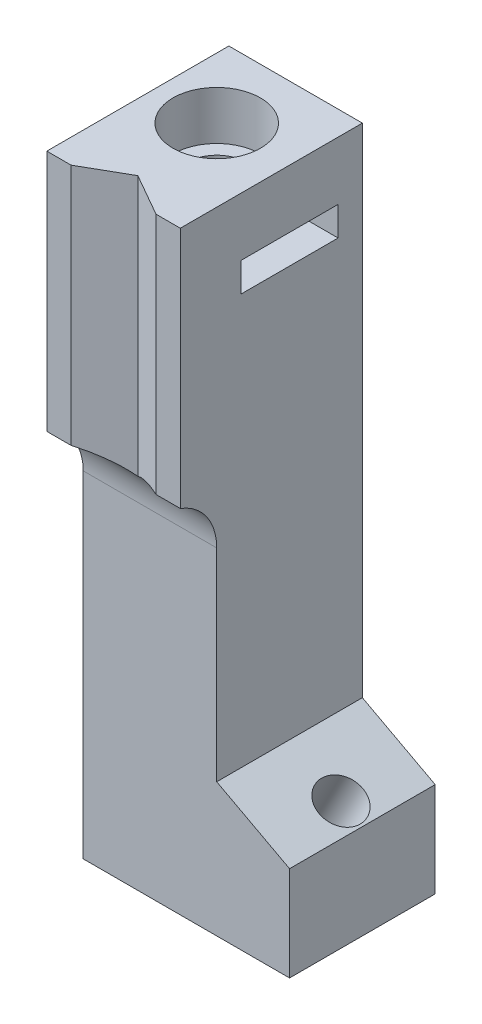
ISO-10303-21;
HEADER;
FILE_DESCRIPTION(('STEP AP214'),'2;1');
FILE_NAME('part.step','',(''),(''),'','','');
FILE_SCHEMA(('AUTOMOTIVE_DESIGN { 1 0 10303 214 1 1 1 1 }'));
ENDSEC;
DATA;
#1=APPLICATION_CONTEXT('core data for automotive mechanical design processes');
#2=APPLICATION_PROTOCOL_DEFINITION('international standard','automotive_design',2000,#1);
#3=PRODUCT_CONTEXT('',#1,'mechanical');
#4=PRODUCT('Part','Part','',(#3));
#5=PRODUCT_RELATED_PRODUCT_CATEGORY('part','',(#4));
#6=PRODUCT_DEFINITION_FORMATION('','',#4);
#7=PRODUCT_DEFINITION_CONTEXT('part definition',#1,'design');
#8=PRODUCT_DEFINITION('design','',#6,#7);
#9=PRODUCT_DEFINITION_SHAPE('','',#8);
#10=(LENGTH_UNIT() NAMED_UNIT(*) SI_UNIT(.MILLI.,.METRE.));
#11=(NAMED_UNIT(*) PLANE_ANGLE_UNIT() SI_UNIT($,.RADIAN.));
#12=(NAMED_UNIT(*) SI_UNIT($,.STERADIAN.) SOLID_ANGLE_UNIT());
#13=UNCERTAINTY_MEASURE_WITH_UNIT(LENGTH_MEASURE(1.E-05),#10,'distance_accuracy_value','');
#14=(GEOMETRIC_REPRESENTATION_CONTEXT(3) GLOBAL_UNCERTAINTY_ASSIGNED_CONTEXT((#13)) GLOBAL_UNIT_ASSIGNED_CONTEXT((#10,
#11,#12)) REPRESENTATION_CONTEXT('',''));
#15=CARTESIAN_POINT('',(0.,0.,0.));
#16=DIRECTION('',(0.,0.,1.));
#17=DIRECTION('',(1.,0.,0.));
#18=AXIS2_PLACEMENT_3D('',#15,#16,#17);
#19=CARTESIAN_POINT('',(2.50000000000003,19.75,0.));
#20=DIRECTION('',(0.,-1.,0.));
#21=DIRECTION('',(1.,0.,0.));
#22=AXIS2_PLACEMENT_3D('',#19,#20,#21);
#23=CYLINDRICAL_SURFACE('',#22,0.605);
#24=CARTESIAN_POINT('',(2.50000000000003,19.55,0.));
#25=DIRECTION('',(0.,1.,0.));
#26=DIRECTION('',(0.,0.,1.));
#27=AXIS2_PLACEMENT_3D('',#24,#25,#26);
#28=CIRCLE('',#27,0.605);
#29=CARTESIAN_POINT('',(2.50000000000003,19.55,0.605000000000023));
#30=VERTEX_POINT('',#29);
#31=EDGE_CURVE('E200',#30,#30,#28,.T.);
#32=ORIENTED_EDGE('',*,*,#31,.F.);
#33=EDGE_LOOP('',(#32));
#34=FACE_BOUND('',#33,.T.);
#35=CARTESIAN_POINT('',(2.50000000000003,19.75,0.));
#36=DIRECTION('',(0.,1.,0.));
#37=DIRECTION('',(-1.,0.,0.));
#38=AXIS2_PLACEMENT_3D('',#35,#36,#37);
#39=CIRCLE('',#38,0.605);
#40=CARTESIAN_POINT('',(1.89500000000003,19.75,0.));
#41=VERTEX_POINT('',#40);
#42=EDGE_CURVE('E240',#41,#41,#39,.T.);
#43=ORIENTED_EDGE('',*,*,#42,.T.);
#44=EDGE_LOOP('',(#43));
#45=FACE_BOUND('',#44,.T.);
#46=ADVANCED_FACE('F39',(#34,#45),#23,.F.);
#47=CARTESIAN_POINT('',(0.,0.,2.24999999996326));
#48=DIRECTION('',(0.,0.,-1.));
#49=DIRECTION('',(-1.,0.,0.));
#50=AXIS2_PLACEMENT_3D('',#47,#48,#49);
#51=PLANE('',#50);
#52=DIRECTION('',(1.,0.,0.));
#53=VECTOR('',#52,1.);
#54=CARTESIAN_POINT('',(4.00000000001019,15.75,2.24999999996326));
#55=LINE('',#54,#53);
#56=CARTESIAN_POINT('',(1.25000000001018,15.75,2.24999999996326));
#57=VERTEX_POINT('',#56);
#58=CARTESIAN_POINT('',(1.75000000001019,15.75,2.24999999996326));
#59=VERTEX_POINT('',#58);
#60=EDGE_CURVE('E221',#57,#59,#55,.T.);
#61=ORIENTED_EDGE('',*,*,#60,.T.);
#62=DIRECTION('',(0.,1.,0.));
#63=VECTOR('',#62,1.);
#64=CARTESIAN_POINT('',(1.75000000001014,0.,2.24999999996326));
#65=LINE('',#64,#63);
#66=CARTESIAN_POINT('',(1.7500000000102,20.75,2.24999999996327));
#67=VERTEX_POINT('',#66);
#68=EDGE_CURVE('E324',#59,#67,#65,.T.);
#69=ORIENTED_EDGE('',*,*,#68,.T.);
#70=DIRECTION('',(-1.,0.,0.));
#71=VECTOR('',#70,1.);
#72=CARTESIAN_POINT('',(4.00000000001018,20.75,2.24999999996326));
#73=LINE('',#72,#71);
#74=CARTESIAN_POINT('',(1.25000000001019,20.75,2.24999999996326));
#75=VERTEX_POINT('',#74);
#76=EDGE_CURVE('E213',#67,#75,#73,.T.);
#77=ORIENTED_EDGE('',*,*,#76,.T.);
#78=DIRECTION('',(0.,-1.,0.));
#79=VECTOR('',#78,1.);
#80=CARTESIAN_POINT('',(1.25000000001019,20.75,2.24999999996326));
#81=LINE('',#80,#79);
#82=EDGE_CURVE('E217',#75,#57,#81,.T.);
#83=ORIENTED_EDGE('',*,*,#82,.T.);
#84=EDGE_LOOP('',(#61,#69,#77,#83));
#85=FACE_BOUND('',#84,.T.);
#86=ADVANCED_FACE('F347',(#85),#51,.F.);
#87=CARTESIAN_POINT('',(0.,19.75,0.));
#88=DIRECTION('',(0.,1.,0.));
#89=DIRECTION('',(-1.,0.,0.));
#90=AXIS2_PLACEMENT_3D('',#87,#88,#89);
#91=PLANE('',#90);
#92=ORIENTED_EDGE('',*,*,#42,.F.);
#93=EDGE_LOOP('',(#92));
#94=FACE_BOUND('',#93,.T.);
#95=CARTESIAN_POINT('',(2.50000000000002,19.75,0.));
#96=DIRECTION('',(0.,1.,0.));
#97=DIRECTION('',(-1.,0.,0.));
#98=AXIS2_PLACEMENT_3D('',#95,#96,#97);
#99=CIRCLE('',#98,0.9);
#100=CARTESIAN_POINT('',(1.60000000000002,19.75,0.));
#101=VERTEX_POINT('',#100);
#102=EDGE_CURVE('E224',#101,#101,#99,.T.);
#103=ORIENTED_EDGE('',*,*,#102,.T.);
#104=EDGE_LOOP('',(#103));
#105=FACE_BOUND('',#104,.T.);
#106=ADVANCED_FACE('F352',(#94,#105),#91,.T.);
#107=CARTESIAN_POINT('',(0.,18.75,0.));
#108=DIRECTION('',(0.,1.,0.));
#109=DIRECTION('',(-1.,0.,0.));
#110=AXIS2_PLACEMENT_3D('',#107,#108,#109);
#111=PLANE('',#110);
#112=CARTESIAN_POINT('',(2.50000000000001,18.75,0.));
#113=DIRECTION('',(0.,1.,0.));
#114=DIRECTION('',(-1.,0.,0.));
#115=AXIS2_PLACEMENT_3D('',#112,#113,#114);
#116=CIRCLE('',#115,0.425);
#117=CARTESIAN_POINT('',(2.07500000000001,18.75,0.));
#118=VERTEX_POINT('',#117);
#119=EDGE_CURVE('E292',#118,#118,#116,.T.);
#120=ORIENTED_EDGE('',*,*,#119,.F.);
#121=EDGE_LOOP('',(#120));
#122=FACE_BOUND('',#121,.T.);
#123=CARTESIAN_POINT('',(2.50000000000003,18.75,0.));
#124=DIRECTION('',(0.,1.,0.));
#125=DIRECTION('',(-1.,0.,0.));
#126=AXIS2_PLACEMENT_3D('',#123,#124,#125);
#127=CIRCLE('',#126,0.605);
#128=CARTESIAN_POINT('',(1.89500000000003,18.75,0.));
#129=VERTEX_POINT('',#128);
#130=EDGE_CURVE('E239',#129,#129,#127,.T.);
#131=ORIENTED_EDGE('',*,*,#130,.T.);
#132=EDGE_LOOP('',(#131));
#133=FACE_BOUND('',#132,.T.);
#134=ADVANCED_FACE('F355',(#122,#133),#111,.T.);
#135=CARTESIAN_POINT('',(1.25000000001017,17.75,1.49999999996326));
#136=DIRECTION('',(-1.,0.,0.));
#137=DIRECTION('',(0.,0.,1.));
#138=AXIS2_PLACEMENT_3D('',#135,#136,#137);
#139=PLANE('',#138);
#140=DIRECTION('',(0.,-1.,0.));
#141=VECTOR('',#140,1.);
#142=CARTESIAN_POINT('',(1.25000000001017,18.95,-0.999999999963246));
#143=LINE('',#142,#141);
#144=CARTESIAN_POINT('',(1.25000000001017,19.55,-0.999999999963246));
#145=VERTEX_POINT('',#144);
#146=CARTESIAN_POINT('',(1.25000000001017,18.95,-0.999999999963245));
#147=VERTEX_POINT('',#146);
#148=EDGE_CURVE('E54',#145,#147,#143,.T.);
#149=ORIENTED_EDGE('',*,*,#148,.F.);
#150=DIRECTION('',(0.,0.,-1.));
#151=VECTOR('',#150,1.);
#152=CARTESIAN_POINT('',(1.25000000001017,19.55,-0.999999999963246));
#153=LINE('',#152,#151);
#154=CARTESIAN_POINT('',(1.25000000001017,19.55,1.00000000003675));
#155=VERTEX_POINT('',#154);
#156=EDGE_CURVE('E188',#155,#145,#153,.T.);
#157=ORIENTED_EDGE('',*,*,#156,.F.);
#158=DIRECTION('',(0.,1.,0.));
#159=VECTOR('',#158,1.);
#160=CARTESIAN_POINT('',(1.25000000001017,18.95,1.00000000003675));
#161=LINE('',#160,#159);
#162=CARTESIAN_POINT('',(1.25000000001017,18.95,1.00000000003675));
#163=VERTEX_POINT('',#162);
#164=EDGE_CURVE('E172',#163,#155,#161,.T.);
#165=ORIENTED_EDGE('',*,*,#164,.F.);
#166=DIRECTION('',(0.,0.,1.));
#167=VECTOR('',#166,1.);
#168=CARTESIAN_POINT('',(1.25000000001017,18.95,-0.999999999963246));
#169=LINE('',#168,#167);
#170=EDGE_CURVE('E180',#147,#163,#169,.T.);
#171=ORIENTED_EDGE('',*,*,#170,.F.);
#172=EDGE_LOOP('',(#149,#157,#165,#171));
#173=FACE_BOUND('',#172,.T.);
#174=DIRECTION('',(0.,0.,-1.));
#175=VECTOR('',#174,1.);
#176=CARTESIAN_POINT('',(1.25000000001017,7.75,1.49999999996326));
#177=LINE('',#176,#175);
#178=CARTESIAN_POINT('',(1.25000000001017,7.75,-0.787687442733548));
#179=VERTEX_POINT('',#178);
#180=CARTESIAN_POINT('',(1.25000000001017,7.75,-1.50000000003674));
#181=VERTEX_POINT('',#180);
#182=EDGE_CURVE('E295',#179,#181,#177,.T.);
#183=ORIENTED_EDGE('',*,*,#182,.F.);
#184=DIRECTION('',(0.,1.,0.));
#185=VECTOR('',#184,1.);
#186=CARTESIAN_POINT('',(1.25000000001017,17.75,-0.787687442733547));
#187=LINE('',#186,#185);
#188=CARTESIAN_POINT('',(1.25000000001017,17.75,-0.787687442733547));
#189=VERTEX_POINT('',#188);
#190=EDGE_CURVE('E288',#179,#189,#187,.T.);
#191=ORIENTED_EDGE('',*,*,#190,.T.);
#192=DIRECTION('',(0.,0.,1.));
#193=VECTOR('',#192,1.);
#194=CARTESIAN_POINT('',(1.25000000001017,17.75,1.49999999996326));
#195=LINE('',#194,#193);
#196=CARTESIAN_POINT('',(1.25000000001017,17.75,0.787687442733547));
#197=VERTEX_POINT('',#196);
#198=EDGE_CURVE('E318',#189,#197,#195,.T.);
#199=ORIENTED_EDGE('',*,*,#198,.T.);
#200=DIRECTION('',(0.,-1.,0.));
#201=VECTOR('',#200,1.);
#202=CARTESIAN_POINT('',(1.25000000001017,17.75,0.787687442733547));
#203=LINE('',#202,#201);
#204=CARTESIAN_POINT('',(1.25000000001017,7.75,0.787687442733547));
#205=VERTEX_POINT('',#204);
#206=EDGE_CURVE('E285',#197,#205,#203,.T.);
#207=ORIENTED_EDGE('',*,*,#206,.T.);
#208=CARTESIAN_POINT('',(1.25000000001017,7.75,1.49999999996326));
#209=VERTEX_POINT('',#208);
#210=EDGE_CURVE('E296',#209,#205,#177,.T.);
#211=ORIENTED_EDGE('',*,*,#210,.F.);
#212=DIRECTION('',(0.,-1.,0.));
#213=VECTOR('',#212,1.);
#214=CARTESIAN_POINT('',(1.25000000001017,17.75,1.49999999996326));
#215=LINE('',#214,#213);
#216=CARTESIAN_POINT('',(1.25000000001017,14.6718070673576,1.49999999996326));
#217=VERTEX_POINT('',#216);
#218=EDGE_CURVE('E305',#217,#209,#215,.T.);
#219=ORIENTED_EDGE('',*,*,#218,.F.);
#220=CARTESIAN_POINT('',(1.25000000001017,14.6718070673576,2.64999999996326));
#221=DIRECTION('',(-1.,0.,0.));
#222=DIRECTION('',(0.,0.,1.));
#223=AXIS2_PLACEMENT_3D('',#220,#221,#222);
#224=CIRCLE('',#223,1.15);
#225=EDGE_CURVE('E336',#217,#57,#224,.F.);
#226=ORIENTED_EDGE('',*,*,#225,.T.);
#227=ORIENTED_EDGE('',*,*,#82,.F.);
#228=DIRECTION('',(0.,0.,1.));
#229=VECTOR('',#228,1.);
#230=CARTESIAN_POINT('',(1.25000000001019,20.75,-1.49999999996325));
#231=LINE('',#230,#229);
#232=CARTESIAN_POINT('',(1.25000000001019,20.75,-1.49999999996325));
#233=VERTEX_POINT('',#232);
#234=EDGE_CURVE('E236',#233,#75,#231,.T.);
#235=ORIENTED_EDGE('',*,*,#234,.F.);
#236=DIRECTION('',(0.,-1.,0.));
#237=VECTOR('',#236,1.);
#238=CARTESIAN_POINT('',(1.25000000001017,17.75,-1.50000000003674));
#239=LINE('',#238,#237);
#240=EDGE_CURVE('E304',#233,#181,#239,.T.);
#241=ORIENTED_EDGE('',*,*,#240,.T.);
#242=EDGE_LOOP('',(#183,#191,#199,#207,#211,#219,#226,#227,#235,#241));
#243=FACE_BOUND('',#242,.T.);
#244=ADVANCED_FACE('F185',(#173,#243),#139,.T.);
#245=CARTESIAN_POINT('',(0.,7.75,0.));
#246=DIRECTION('',(0.,1.,0.));
#247=DIRECTION('',(0.,0.,1.));
#248=AXIS2_PLACEMENT_3D('',#245,#246,#247);
#249=PLANE('',#248);
#250=CARTESIAN_POINT('',(3.8933333333435,7.75,0.));
#251=DIRECTION('',(0.,1.,0.));
#252=DIRECTION('',(1.,0.,0.));
#253=AXIS2_PLACEMENT_3D('',#250,#251,#252);
#254=ELLIPSE('',#253,0.50999999993427,0.449999999942003);
#255=CARTESIAN_POINT('',(4.40333333327777,7.75,0.));
#256=VERTEX_POINT('',#255);
#257=EDGE_CURVE('E708',#256,#256,#254,.T.);
#258=ORIENTED_EDGE('',*,*,#257,.T.);
#259=EDGE_LOOP('',(#258));
#260=FACE_BOUND('',#259,.T.);
#261=DIRECTION('',(-0.99954579976556,0.,0.0301362600703328));
#262=VECTOR('',#261,1.);
#263=CARTESIAN_POINT('',(0.,7.75,-0.75));
#264=LINE('',#263,#262);
#265=CARTESIAN_POINT('',(2.47513758544198,7.75,-0.824625284806589));
#266=VERTEX_POINT('',#265);
#267=EDGE_CURVE('E270',#266,#179,#264,.T.);
#268=ORIENTED_EDGE('',*,*,#267,.T.);
#269=ORIENTED_EDGE('',*,*,#182,.T.);
#270=DIRECTION('',(1.,0.,2.67195514451353E-11));
#271=VECTOR('',#270,1.);
#272=CARTESIAN_POINT('',(4.00000000001017,7.75,-1.49999999996326));
#273=LINE('',#272,#271);
#274=CARTESIAN_POINT('',(5.50000000001019,7.75,-1.49999999994322));
#275=VERTEX_POINT('',#274);
#276=EDGE_CURVE('E299',#181,#275,#273,.T.);
#277=ORIENTED_EDGE('',*,*,#276,.T.);
#278=DIRECTION('',(0.,0.,1.));
#279=VECTOR('',#278,1.);
#280=CARTESIAN_POINT('',(5.50000000001019,7.75,-4.63249102147864));
#281=LINE('',#280,#279);
#282=CARTESIAN_POINT('',(5.50000000001019,7.75,1.49999999996326));
#283=VERTEX_POINT('',#282);
#284=EDGE_CURVE('E249',#275,#283,#281,.T.);
#285=ORIENTED_EDGE('',*,*,#284,.T.);
#286=DIRECTION('',(-1.,0.,0.));
#287=VECTOR('',#286,1.);
#288=CARTESIAN_POINT('',(4.00000000001017,7.75,1.49999999996326));
#289=LINE('',#288,#287);
#290=EDGE_CURVE('E301',#283,#209,#289,.T.);
#291=ORIENTED_EDGE('',*,*,#290,.T.);
#292=ORIENTED_EDGE('',*,*,#210,.T.);
#293=DIRECTION('',(-0.99954579976556,0.,-0.0301362600703316));
#294=VECTOR('',#293,1.);
#295=CARTESIAN_POINT('',(-0.0225919291304569,7.75,0.749318854371731));
#296=LINE('',#295,#294);
#297=CARTESIAN_POINT('',(2.47513758544198,7.75,0.824625284806587));
#298=VERTEX_POINT('',#297);
#299=EDGE_CURVE('E307',#298,#205,#296,.T.);
#300=ORIENTED_EDGE('',*,*,#299,.F.);
#301=CARTESIAN_POINT('',(2.5,7.75,0.));
#302=DIRECTION('',(0.,1.,0.));
#303=DIRECTION('',(0.,0.,-1.));
#304=AXIS2_PLACEMENT_3D('',#301,#302,#303);
#305=CIRCLE('',#304,0.825000000000001);
#306=EDGE_CURVE('E262',#298,#266,#305,.T.);
#307=ORIENTED_EDGE('',*,*,#306,.T.);
#308=EDGE_LOOP('',(#268,#269,#277,#285,#291,#292,#300,#307));
#309=FACE_BOUND('',#308,.T.);
#310=ADVANCED_FACE('F411',(#260,#309),#249,.F.);
#311=CARTESIAN_POINT('',(4.00000000001017,17.75,1.49999999996326));
#312=DIRECTION('',(0.,0.,1.));
#313=DIRECTION('',(1.,0.,0.));
#314=AXIS2_PLACEMENT_3D('',#311,#312,#313);
#315=PLANE('',#314);
#316=DIRECTION('',(0.,-1.,0.));
#317=VECTOR('',#316,1.);
#318=CARTESIAN_POINT('',(4.00000000001017,17.75,1.49999999996326));
#319=LINE('',#318,#317);
#320=CARTESIAN_POINT('',(4.00000000001017,14.6718070673576,1.49999999996326));
#321=VERTEX_POINT('',#320);
#322=CARTESIAN_POINT('',(4.0000000000102,10.5,1.49999999996326));
#323=VERTEX_POINT('',#322);
#324=EDGE_CURVE('E308',#321,#323,#319,.T.);
#325=ORIENTED_EDGE('',*,*,#324,.F.);
#326=DIRECTION('',(1.,0.,0.));
#327=VECTOR('',#326,1.);
#328=CARTESIAN_POINT('',(1.25000000001017,14.6718070673576,1.49999999996326));
#329=LINE('',#328,#327);
#330=EDGE_CURVE('E327',#321,#217,#329,.F.);
#331=ORIENTED_EDGE('',*,*,#330,.T.);
#332=ORIENTED_EDGE('',*,*,#218,.T.);
#333=ORIENTED_EDGE('',*,*,#290,.F.);
#334=DIRECTION('',(0.,1.,0.));
#335=VECTOR('',#334,1.);
#336=CARTESIAN_POINT('',(5.50000000001019,7.75,1.49999999996326));
#337=LINE('',#336,#335);
#338=CARTESIAN_POINT('',(5.50000000001019,9.7,1.49999999996326));
#339=VERTEX_POINT('',#338);
#340=EDGE_CURVE('E246',#283,#339,#337,.T.);
#341=ORIENTED_EDGE('',*,*,#340,.T.);
#342=DIRECTION('',(-0.882352941176471,0.470588235294117,0.));
#343=VECTOR('',#342,1.);
#344=CARTESIAN_POINT('',(5.5000000000102,9.7,1.49999999996326));
#345=LINE('',#344,#343);
#346=EDGE_CURVE('E243',#339,#323,#345,.T.);
#347=ORIENTED_EDGE('',*,*,#346,.T.);
#348=EDGE_LOOP('',(#325,#331,#332,#333,#341,#347));
#349=FACE_BOUND('',#348,.T.);
#350=ADVANCED_FACE('F414',(#349),#315,.T.);
#351=CARTESIAN_POINT('',(4.00000000001017,17.75,1.49999999996326));
#352=DIRECTION('',(1.,0.,0.));
#353=DIRECTION('',(0.,0.,-1.));
#354=AXIS2_PLACEMENT_3D('',#351,#352,#353);
#355=PLANE('',#354);
#356=DIRECTION('',(0.,1.,0.));
#357=VECTOR('',#356,1.);
#358=CARTESIAN_POINT('',(4.00000000001017,17.75,-0.999999999963246));
#359=LINE('',#358,#357);
#360=CARTESIAN_POINT('',(4.00000000001017,18.95,-0.999999999963246));
#361=VERTEX_POINT('',#360);
#362=CARTESIAN_POINT('',(4.00000000001017,19.55,-0.999999999963246));
#363=VERTEX_POINT('',#362);
#364=EDGE_CURVE('E11',#361,#363,#359,.T.);
#365=ORIENTED_EDGE('',*,*,#364,.F.);
#366=DIRECTION('',(0.,0.,-1.));
#367=VECTOR('',#366,1.);
#368=CARTESIAN_POINT('',(4.00000000001017,18.95,1.49999999996326));
#369=LINE('',#368,#367);
#370=CARTESIAN_POINT('',(4.00000000001017,18.95,1.00000000003675));
#371=VERTEX_POINT('',#370);
#372=EDGE_CURVE('E198',#371,#361,#369,.T.);
#373=ORIENTED_EDGE('',*,*,#372,.F.);
#374=DIRECTION('',(0.,-1.,0.));
#375=VECTOR('',#374,1.);
#376=CARTESIAN_POINT('',(4.00000000001017,17.75,1.00000000003675));
#377=LINE('',#376,#375);
#378=CARTESIAN_POINT('',(4.00000000001017,19.55,1.00000000003675));
#379=VERTEX_POINT('',#378);
#380=EDGE_CURVE('E47',#379,#371,#377,.T.);
#381=ORIENTED_EDGE('',*,*,#380,.F.);
#382=DIRECTION('',(0.,0.,1.));
#383=VECTOR('',#382,1.);
#384=CARTESIAN_POINT('',(4.00000000001017,19.55,1.49999999996326));
#385=LINE('',#384,#383);
#386=EDGE_CURVE('E201',#363,#379,#385,.T.);
#387=ORIENTED_EDGE('',*,*,#386,.F.);
#388=EDGE_LOOP('',(#365,#373,#381,#387));
#389=FACE_BOUND('',#388,.T.);
#390=DIRECTION('',(0.,0.,1.));
#391=VECTOR('',#390,1.);
#392=CARTESIAN_POINT('',(4.0000000000102,10.5,-4.63249102147864));
#393=LINE('',#392,#391);
#394=CARTESIAN_POINT('',(4.00000000001017,10.5,-1.49999999996326));
#395=VERTEX_POINT('',#394);
#396=EDGE_CURVE('E255',#395,#323,#393,.T.);
#397=ORIENTED_EDGE('',*,*,#396,.F.);
#398=DIRECTION('',(0.,-1.,0.));
#399=VECTOR('',#398,1.);
#400=CARTESIAN_POINT('',(4.00000000001017,17.75,-1.49999999996326));
#401=LINE('',#400,#399);
#402=CARTESIAN_POINT('',(4.00000000001019,20.75,-1.49999999996325));
#403=VERTEX_POINT('',#402);
#404=EDGE_CURVE('E310',#403,#395,#401,.T.);
#405=ORIENTED_EDGE('',*,*,#404,.F.);
#406=DIRECTION('',(0.,0.,-1.));
#407=VECTOR('',#406,1.);
#408=CARTESIAN_POINT('',(4.00000000001019,20.75,-1.49999999996325));
#409=LINE('',#408,#407);
#410=CARTESIAN_POINT('',(4.00000000001018,20.75,2.24999999996326));
#411=VERTEX_POINT('',#410);
#412=EDGE_CURVE('E228',#411,#403,#409,.T.);
#413=ORIENTED_EDGE('',*,*,#412,.F.);
#414=DIRECTION('',(0.,1.,0.));
#415=VECTOR('',#414,1.);
#416=CARTESIAN_POINT('',(4.00000000001018,20.75,2.24999999996326));
#417=LINE('',#416,#415);
#418=CARTESIAN_POINT('',(4.00000000001019,15.75,2.24999999996326));
#419=VERTEX_POINT('',#418);
#420=EDGE_CURVE('E210',#419,#411,#417,.T.);
#421=ORIENTED_EDGE('',*,*,#420,.F.);
#422=CARTESIAN_POINT('',(4.00000000001017,14.6718070673576,2.64999999996326));
#423=DIRECTION('',(1.,0.,0.));
#424=DIRECTION('',(0.,0.,-1.));
#425=AXIS2_PLACEMENT_3D('',#422,#423,#424);
#426=CIRCLE('',#425,1.15);
#427=EDGE_CURVE('E334',#419,#321,#426,.F.);
#428=ORIENTED_EDGE('',*,*,#427,.T.);
#429=ORIENTED_EDGE('',*,*,#324,.T.);
#430=EDGE_LOOP('',(#397,#405,#413,#421,#428,#429));
#431=FACE_BOUND('',#430,.T.);
#432=ADVANCED_FACE('F418',(#389,#431),#355,.T.);
#433=CARTESIAN_POINT('',(4.00000000001017,17.75,-1.49999999996326));
#434=DIRECTION('',(2.67195514451353E-11,0.,-1.));
#435=DIRECTION('',(-1.,0.,-2.67195514451353E-11));
#436=AXIS2_PLACEMENT_3D('',#433,#434,#435);
#437=PLANE('',#436);
#438=ORIENTED_EDGE('',*,*,#276,.F.);
#439=ORIENTED_EDGE('',*,*,#240,.F.);
#440=DIRECTION('',(-1.,0.,0.));
#441=VECTOR('',#440,1.);
#442=CARTESIAN_POINT('',(4.00000000001019,20.75,-1.49999999996325));
#443=LINE('',#442,#441);
#444=EDGE_CURVE('E233',#403,#233,#443,.T.);
#445=ORIENTED_EDGE('',*,*,#444,.F.);
#446=ORIENTED_EDGE('',*,*,#404,.T.);
#447=DIRECTION('',(-0.882352941176471,0.470588235294117,-2.35760748045312E-11));
#448=VECTOR('',#447,1.);
#449=CARTESIAN_POINT('',(5.49999999994503,9.70000000003475,-1.49999999992318));
#450=LINE('',#449,#448);
#451=CARTESIAN_POINT('',(5.50000000001019,9.7,-1.49999999992318));
#452=VERTEX_POINT('',#451);
#453=EDGE_CURVE('E252',#452,#395,#450,.T.);
#454=ORIENTED_EDGE('',*,*,#453,.F.);
#455=DIRECTION('',(0.,1.,0.));
#456=VECTOR('',#455,1.);
#457=CARTESIAN_POINT('',(5.50000000001019,7.75,-1.49999999992318));
#458=LINE('',#457,#456);
#459=EDGE_CURVE('E257',#275,#452,#458,.T.);
#460=ORIENTED_EDGE('',*,*,#459,.F.);
#461=EDGE_LOOP('',(#438,#439,#445,#446,#454,#460));
#462=FACE_BOUND('',#461,.T.);
#463=ADVANCED_FACE('F406',(#462),#437,.T.);
#464=CARTESIAN_POINT('',(2.50000000000001,18.75,0.));
#465=DIRECTION('',(0.,-1.,0.));
#466=DIRECTION('',(1.,0.,0.));
#467=AXIS2_PLACEMENT_3D('',#464,#465,#466);
#468=CYLINDRICAL_SURFACE('',#467,0.425);
#469=ORIENTED_EDGE('',*,*,#119,.T.);
#470=EDGE_LOOP('',(#469));
#471=FACE_BOUND('',#470,.T.);
#472=CARTESIAN_POINT('',(2.50000000000001,17.75,0.));
#473=DIRECTION('',(0.,1.,0.));
#474=DIRECTION('',(0.,0.,1.));
#475=AXIS2_PLACEMENT_3D('',#472,#473,#474);
#476=CIRCLE('',#475,0.425);
#477=CARTESIAN_POINT('',(2.50000000000001,17.75,0.425000000000002));
#478=VERTEX_POINT('',#477);
#479=EDGE_CURVE('E291',#478,#478,#476,.F.);
#480=ORIENTED_EDGE('',*,*,#479,.T.);
#481=EDGE_LOOP('',(#480));
#482=FACE_BOUND('',#481,.T.);
#483=ADVANCED_FACE('F402',(#471,#482),#468,.F.);
#484=CARTESIAN_POINT('',(2.5,17.75,0.));
#485=DIRECTION('',(0.,-1.,0.));
#486=DIRECTION('',(0.,0.,-1.));
#487=AXIS2_PLACEMENT_3D('',#484,#485,#486);
#488=CYLINDRICAL_SURFACE('',#487,0.825000000000001);
#489=ORIENTED_EDGE('',*,*,#306,.F.);
#490=DIRECTION('',(0.,-1.,0.));
#491=VECTOR('',#490,1.);
#492=CARTESIAN_POINT('',(2.47513758544198,17.75,0.824625284806587));
#493=LINE('',#492,#491);
#494=CARTESIAN_POINT('',(2.47513758544198,17.75,0.824625284806587));
#495=VERTEX_POINT('',#494);
#496=EDGE_CURVE('E275',#495,#298,#493,.T.);
#497=ORIENTED_EDGE('',*,*,#496,.F.);
#498=CARTESIAN_POINT('',(2.5,17.75,0.));
#499=DIRECTION('',(0.,1.,0.));
#500=DIRECTION('',(0.,0.,-1.));
#501=AXIS2_PLACEMENT_3D('',#498,#499,#500);
#502=CIRCLE('',#501,0.825000000000001);
#503=CARTESIAN_POINT('',(2.47513758544198,17.75,-0.824625284806589));
#504=VERTEX_POINT('',#503);
#505=EDGE_CURVE('E266',#495,#504,#502,.T.);
#506=ORIENTED_EDGE('',*,*,#505,.T.);
#507=DIRECTION('',(0.,-1.,0.));
#508=VECTOR('',#507,1.);
#509=CARTESIAN_POINT('',(2.47513758544198,17.75,-0.824625284806589));
#510=LINE('',#509,#508);
#511=EDGE_CURVE('E282',#504,#266,#510,.T.);
#512=ORIENTED_EDGE('',*,*,#511,.T.);
#513=EDGE_LOOP('',(#489,#497,#506,#512));
#514=FACE_BOUND('',#513,.T.);
#515=ADVANCED_FACE('F398',(#514),#488,.F.);
#516=CARTESIAN_POINT('',(0.,17.75,-0.75));
#517=DIRECTION('',(0.0301362600703328,0.,0.99954579976556));
#518=DIRECTION('',(0.99954579976556,0.,-0.0301362600703328));
#519=AXIS2_PLACEMENT_3D('',#516,#517,#518);
#520=PLANE('',#519);
#521=ORIENTED_EDGE('',*,*,#267,.F.);
#522=ORIENTED_EDGE('',*,*,#511,.F.);
#523=DIRECTION('',(-0.99954579976556,0.,0.0301362600703328));
#524=VECTOR('',#523,1.);
#525=CARTESIAN_POINT('',(0.,17.75,-0.75));
#526=LINE('',#525,#524);
#527=EDGE_CURVE('E269',#504,#189,#526,.T.);
#528=ORIENTED_EDGE('',*,*,#527,.T.);
#529=ORIENTED_EDGE('',*,*,#190,.F.);
#530=EDGE_LOOP('',(#521,#522,#528,#529));
#531=FACE_BOUND('',#530,.T.);
#532=ADVANCED_FACE('F394',(#531),#520,.T.);
#533=CARTESIAN_POINT('',(0.,17.75,0.750000000000001));
#534=DIRECTION('',(0.0301362600703316,0.,-0.99954579976556));
#535=DIRECTION('',(-0.99954579976556,0.,-0.0301362600703316));
#536=AXIS2_PLACEMENT_3D('',#533,#534,#535);
#537=PLANE('',#536);
#538=DIRECTION('',(0.99954579976556,0.,0.0301362600703316));
#539=VECTOR('',#538,1.);
#540=CARTESIAN_POINT('',(0.,17.75,0.750000000000001));
#541=LINE('',#540,#539);
#542=EDGE_CURVE('E273',#197,#495,#541,.T.);
#543=ORIENTED_EDGE('',*,*,#542,.T.);
#544=ORIENTED_EDGE('',*,*,#496,.T.);
#545=ORIENTED_EDGE('',*,*,#299,.T.);
#546=ORIENTED_EDGE('',*,*,#206,.F.);
#547=EDGE_LOOP('',(#543,#544,#545,#546));
#548=FACE_BOUND('',#547,.T.);
#549=ADVANCED_FACE('F390',(#548),#537,.T.);
#550=CARTESIAN_POINT('',(2.5,17.75,0.));
#551=DIRECTION('',(0.,-1.,0.));
#552=DIRECTION('',(0.,0.,-1.));
#553=AXIS2_PLACEMENT_3D('',#550,#551,#552);
#554=PLANE('',#553);
#555=ORIENTED_EDGE('',*,*,#479,.F.);
#556=EDGE_LOOP('',(#555));
#557=FACE_BOUND('',#556,.T.);
#558=ORIENTED_EDGE('',*,*,#527,.F.);
#559=ORIENTED_EDGE('',*,*,#505,.F.);
#560=ORIENTED_EDGE('',*,*,#542,.F.);
#561=ORIENTED_EDGE('',*,*,#198,.F.);
#562=EDGE_LOOP('',(#558,#559,#560,#561));
#563=FACE_BOUND('',#562,.T.);
#564=ADVANCED_FACE('F386',(#557,#563),#554,.T.);
#565=CARTESIAN_POINT('',(5.50000000001019,7.75,-4.63249102147864));
#566=DIRECTION('',(1.,0.,0.));
#567=DIRECTION('',(0.,0.,-1.));
#568=AXIS2_PLACEMENT_3D('',#565,#566,#567);
#569=PLANE('',#568);
#570=ORIENTED_EDGE('',*,*,#284,.F.);
#571=ORIENTED_EDGE('',*,*,#459,.T.);
#572=DIRECTION('',(0.,0.,1.));
#573=VECTOR('',#572,1.);
#574=CARTESIAN_POINT('',(5.50000000001019,9.7,-4.63249102147864));
#575=LINE('',#574,#573);
#576=EDGE_CURVE('E256',#452,#339,#575,.T.);
#577=ORIENTED_EDGE('',*,*,#576,.T.);
#578=ORIENTED_EDGE('',*,*,#340,.F.);
#579=EDGE_LOOP('',(#570,#571,#577,#578));
#580=FACE_BOUND('',#579,.T.);
#581=ADVANCED_FACE('F382',(#580),#569,.T.);
#582=CARTESIAN_POINT('',(5.50000000001019,9.7,-4.63249102147864));
#583=DIRECTION('',(0.470588235294117,0.882352941176471,0.));
#584=DIRECTION('',(-0.882352941176471,0.470588235294117,0.));
#585=AXIS2_PLACEMENT_3D('',#582,#583,#584);
#586=PLANE('',#585);
#587=CARTESIAN_POINT('',(5.05882352942194,9.93529411764707,0.));
#588=DIRECTION('',(0.470588235294117,0.882352941176471,0.));
#589=DIRECTION('',(-0.882352941176471,0.470588235294117,0.));
#590=AXIS2_PLACEMENT_3D('',#587,#588,#589);
#591=CIRCLE('',#590,0.449999999942003);
#592=CARTESIAN_POINT('',(4.6617647059437,10.1470588235021,0.));
#593=VERTEX_POINT('',#592);
#594=EDGE_CURVE('E710',#593,#593,#591,.T.);
#595=ORIENTED_EDGE('',*,*,#594,.F.);
#596=EDGE_LOOP('',(#595));
#597=FACE_BOUND('',#596,.T.);
#598=ORIENTED_EDGE('',*,*,#576,.F.);
#599=ORIENTED_EDGE('',*,*,#453,.T.);
#600=ORIENTED_EDGE('',*,*,#396,.T.);
#601=ORIENTED_EDGE('',*,*,#346,.F.);
#602=EDGE_LOOP('',(#598,#599,#600,#601));
#603=FACE_BOUND('',#602,.T.);
#604=ADVANCED_FACE('F377',(#597,#603),#586,.T.);
#605=CARTESIAN_POINT('',(2.50000000000003,18.95,0.));
#606=DIRECTION('',(0.,-1.,0.));
#607=DIRECTION('',(0.,0.,-1.));
#608=AXIS2_PLACEMENT_3D('',#605,#606,#607);
#609=CIRCLE('',#608,0.605);
#610=CARTESIAN_POINT('',(2.50000000000003,18.95,-0.604999999999978));
#611=VERTEX_POINT('',#610);
#612=EDGE_CURVE('E195',#611,#611,#609,.T.);
#613=ORIENTED_EDGE('',*,*,#612,.F.);
#614=EDGE_LOOP('',(#613));
#615=FACE_BOUND('',#614,.T.);
#616=ORIENTED_EDGE('',*,*,#130,.F.);
#617=EDGE_LOOP('',(#616));
#618=FACE_BOUND('',#617,.T.);
#619=ADVANCED_FACE('F349',(#615,#618),#23,.F.);
#620=CARTESIAN_POINT('',(0.,20.75,0.));
#621=DIRECTION('',(0.,-1.,0.));
#622=DIRECTION('',(1.,0.,0.));
#623=AXIS2_PLACEMENT_3D('',#620,#621,#622);
#624=PLANE('',#623);
#625=ORIENTED_EDGE('',*,*,#76,.F.);
#626=DIRECTION('',(-0.868243142124459,0.,0.496138938356834));
#627=VECTOR('',#626,1.);
#628=CARTESIAN_POINT('',(1.7500000000102,20.75,2.24999999996327));
#629=LINE('',#628,#627);
#630=CARTESIAN_POINT('',(2.6250000000102,20.75,1.74999999996327));
#631=VERTEX_POINT('',#630);
#632=EDGE_CURVE('E206',#631,#67,#629,.T.);
#633=ORIENTED_EDGE('',*,*,#632,.F.);
#634=DIRECTION('',(-0.868243142124459,0.,-0.496138938356834));
#635=VECTOR('',#634,1.);
#636=CARTESIAN_POINT('',(2.6250000000102,20.75,1.74999999996327));
#637=LINE('',#636,#635);
#638=CARTESIAN_POINT('',(3.5000000000102,20.75,2.24999999996327));
#639=VERTEX_POINT('',#638);
#640=EDGE_CURVE('E203',#639,#631,#637,.T.);
#641=ORIENTED_EDGE('',*,*,#640,.F.);
#642=EDGE_CURVE('E214',#411,#639,#73,.T.);
#643=ORIENTED_EDGE('',*,*,#642,.F.);
#644=ORIENTED_EDGE('',*,*,#412,.T.);
#645=ORIENTED_EDGE('',*,*,#444,.T.);
#646=ORIENTED_EDGE('',*,*,#234,.T.);
#647=EDGE_LOOP('',(#625,#633,#641,#643,#644,#645,#646));
#648=FACE_BOUND('',#647,.T.);
#649=CARTESIAN_POINT('',(2.50000000000002,20.75,0.));
#650=DIRECTION('',(0.,1.,0.));
#651=DIRECTION('',(-1.,0.,0.));
#652=AXIS2_PLACEMENT_3D('',#649,#650,#651);
#653=CIRCLE('',#652,0.9);
#654=CARTESIAN_POINT('',(1.60000000000002,20.75,0.));
#655=VERTEX_POINT('',#654);
#656=EDGE_CURVE('E225',#655,#655,#653,.T.);
#657=ORIENTED_EDGE('',*,*,#656,.F.);
#658=EDGE_LOOP('',(#657));
#659=FACE_BOUND('',#658,.T.);
#660=ADVANCED_FACE('F362',(#648,#659),#624,.F.);
#661=CARTESIAN_POINT('',(2.50000000000002,20.75,0.));
#662=DIRECTION('',(0.,-1.,0.));
#663=DIRECTION('',(1.,0.,0.));
#664=AXIS2_PLACEMENT_3D('',#661,#662,#663);
#665=CYLINDRICAL_SURFACE('',#664,0.9);
#666=ORIENTED_EDGE('',*,*,#656,.T.);
#667=EDGE_LOOP('',(#666));
#668=FACE_BOUND('',#667,.T.);
#669=ORIENTED_EDGE('',*,*,#102,.F.);
#670=EDGE_LOOP('',(#669));
#671=FACE_BOUND('',#670,.T.);
#672=ADVANCED_FACE('F359',(#668,#671),#665,.F.);
#673=ORIENTED_EDGE('',*,*,#642,.T.);
#674=DIRECTION('',(0.,-1.,0.));
#675=VECTOR('',#674,1.);
#676=CARTESIAN_POINT('',(3.5000000000102,0.,2.24999999996326));
#677=LINE('',#676,#675);
#678=CARTESIAN_POINT('',(3.50000000001019,15.75,2.24999999996326));
#679=VERTEX_POINT('',#678);
#680=EDGE_CURVE('E321',#639,#679,#677,.T.);
#681=ORIENTED_EDGE('',*,*,#680,.T.);
#682=EDGE_CURVE('E220',#679,#419,#55,.T.);
#683=ORIENTED_EDGE('',*,*,#682,.T.);
#684=ORIENTED_EDGE('',*,*,#420,.T.);
#685=EDGE_LOOP('',(#673,#681,#683,#684));
#686=FACE_BOUND('',#685,.T.);
#687=ADVANCED_FACE('F361',(#686),#51,.F.);
#688=CARTESIAN_POINT('',(1.75000000001018,7.74999999999999,2.24999999996325));
#689=DIRECTION('',(-0.496138938356834,0.,-0.868243142124459));
#690=DIRECTION('',(-0.868243142124459,0.,0.496138938356834));
#691=AXIS2_PLACEMENT_3D('',#688,#689,#690);
#692=PLANE('',#691);
#693=DIRECTION('',(0.,1.,0.));
#694=VECTOR('',#693,1.);
#695=CARTESIAN_POINT('',(2.62500000001018,7.74999999999999,1.74999999996325));
#696=LINE('',#695,#694);
#697=CARTESIAN_POINT('',(2.62500000001019,15.3876981205214,1.74999999996326));
#698=VERTEX_POINT('',#697);
#699=EDGE_CURVE('E208',#698,#631,#696,.T.);
#700=ORIENTED_EDGE('',*,*,#699,.T.);
#701=ORIENTED_EDGE('',*,*,#632,.T.);
#702=ORIENTED_EDGE('',*,*,#68,.F.);
#703=CARTESIAN_POINT('',(1.05000000001019,14.6718070673576,2.64999999996326));
#704=DIRECTION('',(-0.496138938356834,0.,-0.868243142124459));
#705=DIRECTION('',(-0.868243142124459,0.,0.496138938356834));
#706=AXIS2_PLACEMENT_3D('',#703,#704,#705);
#707=ELLIPSE('',#706,2.31789910263583,1.15);
#708=EDGE_CURVE('E329',#59,#698,#707,.T.);
#709=ORIENTED_EDGE('',*,*,#708,.T.);
#710=EDGE_LOOP('',(#700,#701,#702,#709));
#711=FACE_BOUND('',#710,.T.);
#712=ADVANCED_FACE('F370',(#711),#692,.F.);
#713=CARTESIAN_POINT('',(2.62500000001018,7.74999999999999,1.74999999996325));
#714=DIRECTION('',(0.496138938356834,0.,-0.868243142124459));
#715=DIRECTION('',(-0.868243142124459,0.,-0.496138938356834));
#716=AXIS2_PLACEMENT_3D('',#713,#714,#715);
#717=PLANE('',#716);
#718=ORIENTED_EDGE('',*,*,#680,.F.);
#719=ORIENTED_EDGE('',*,*,#640,.T.);
#720=ORIENTED_EDGE('',*,*,#699,.F.);
#721=CARTESIAN_POINT('',(4.20000000001019,14.6718070673576,2.64999999996326));
#722=DIRECTION('',(0.496138938356834,0.,-0.868243142124459));
#723=DIRECTION('',(-0.868243142124459,0.,-0.496138938356834));
#724=AXIS2_PLACEMENT_3D('',#721,#722,#723);
#725=ELLIPSE('',#724,2.31789910263583,1.15);
#726=EDGE_CURVE('E332',#698,#679,#725,.T.);
#727=ORIENTED_EDGE('',*,*,#726,.T.);
#728=EDGE_LOOP('',(#718,#719,#720,#727));
#729=FACE_BOUND('',#728,.T.);
#730=ADVANCED_FACE('F621',(#729),#717,.F.);
#731=CARTESIAN_POINT('',(4.00000000001019,14.6718070673576,2.64999999996326));
#732=DIRECTION('',(-1.,0.,0.));
#733=DIRECTION('',(0.,0.,1.));
#734=AXIS2_PLACEMENT_3D('',#731,#732,#733);
#735=CYLINDRICAL_SURFACE('',#734,1.15);
#736=ORIENTED_EDGE('',*,*,#225,.F.);
#737=ORIENTED_EDGE('',*,*,#330,.F.);
#738=ORIENTED_EDGE('',*,*,#427,.F.);
#739=ORIENTED_EDGE('',*,*,#682,.F.);
#740=ORIENTED_EDGE('',*,*,#726,.F.);
#741=ORIENTED_EDGE('',*,*,#708,.F.);
#742=ORIENTED_EDGE('',*,*,#60,.F.);
#743=EDGE_LOOP('',(#736,#737,#738,#739,#740,#741,#742));
#744=FACE_BOUND('',#743,.T.);
#745=ADVANCED_FACE('F41',(#744),#735,.F.);
#746=CARTESIAN_POINT('',(5.50000000001019,18.95,-0.999999999963246));
#747=DIRECTION('',(0.,0.,-1.));
#748=DIRECTION('',(-1.,0.,0.));
#749=AXIS2_PLACEMENT_3D('',#746,#747,#748);
#750=PLANE('',#749);
#751=ORIENTED_EDGE('',*,*,#364,.T.);
#752=DIRECTION('',(-1.,0.,0.));
#753=VECTOR('',#752,1.);
#754=CARTESIAN_POINT('',(5.50000000001019,19.55,-0.999999999963246));
#755=LINE('',#754,#753);
#756=EDGE_CURVE('E193',#363,#145,#755,.T.);
#757=ORIENTED_EDGE('',*,*,#756,.T.);
#758=ORIENTED_EDGE('',*,*,#148,.T.);
#759=DIRECTION('',(-1.,0.,0.));
#760=VECTOR('',#759,1.);
#761=CARTESIAN_POINT('',(5.50000000001019,18.95,-0.999999999963246));
#762=LINE('',#761,#760);
#763=EDGE_CURVE('E177',#361,#147,#762,.T.);
#764=ORIENTED_EDGE('',*,*,#763,.F.);
#765=EDGE_LOOP('',(#751,#757,#758,#764));
#766=FACE_BOUND('',#765,.T.);
#767=ADVANCED_FACE('F603',(#766),#750,.F.);
#768=CARTESIAN_POINT('',(5.50000000001019,19.55,-0.999999999963246));
#769=DIRECTION('',(0.,1.,0.));
#770=DIRECTION('',(0.,0.,1.));
#771=AXIS2_PLACEMENT_3D('',#768,#769,#770);
#772=PLANE('',#771);
#773=ORIENTED_EDGE('',*,*,#386,.T.);
#774=DIRECTION('',(-1.,0.,0.));
#775=VECTOR('',#774,1.);
#776=CARTESIAN_POINT('',(5.50000000001019,19.55,1.00000000003675));
#777=LINE('',#776,#775);
#778=EDGE_CURVE('E176',#379,#155,#777,.T.);
#779=ORIENTED_EDGE('',*,*,#778,.T.);
#780=ORIENTED_EDGE('',*,*,#156,.T.);
#781=ORIENTED_EDGE('',*,*,#756,.F.);
#782=EDGE_LOOP('',(#773,#779,#780,#781));
#783=FACE_BOUND('',#782,.T.);
#784=ORIENTED_EDGE('',*,*,#31,.T.);
#785=EDGE_LOOP('',(#784));
#786=FACE_BOUND('',#785,.T.);
#787=ADVANCED_FACE('F343',(#783,#786),#772,.F.);
#788=CARTESIAN_POINT('',(5.50000000001019,18.95,1.00000000003675));
#789=DIRECTION('',(0.,0.,1.));
#790=DIRECTION('',(1.,0.,0.));
#791=AXIS2_PLACEMENT_3D('',#788,#789,#790);
#792=PLANE('',#791);
#793=ORIENTED_EDGE('',*,*,#380,.T.);
#794=DIRECTION('',(-1.,0.,0.));
#795=VECTOR('',#794,1.);
#796=CARTESIAN_POINT('',(5.50000000001019,18.95,1.00000000003675));
#797=LINE('',#796,#795);
#798=EDGE_CURVE('E62',#371,#163,#797,.T.);
#799=ORIENTED_EDGE('',*,*,#798,.T.);
#800=ORIENTED_EDGE('',*,*,#164,.T.);
#801=ORIENTED_EDGE('',*,*,#778,.F.);
#802=EDGE_LOOP('',(#793,#799,#800,#801));
#803=FACE_BOUND('',#802,.T.);
#804=ADVANCED_FACE('F169',(#803),#792,.F.);
#805=CARTESIAN_POINT('',(5.50000000001019,18.95,-0.999999999963246));
#806=DIRECTION('',(0.,-1.,0.));
#807=DIRECTION('',(0.,0.,-1.));
#808=AXIS2_PLACEMENT_3D('',#805,#806,#807);
#809=PLANE('',#808);
#810=ORIENTED_EDGE('',*,*,#372,.T.);
#811=ORIENTED_EDGE('',*,*,#763,.T.);
#812=ORIENTED_EDGE('',*,*,#170,.T.);
#813=ORIENTED_EDGE('',*,*,#798,.F.);
#814=EDGE_LOOP('',(#810,#811,#812,#813));
#815=FACE_BOUND('',#814,.T.);
#816=ORIENTED_EDGE('',*,*,#612,.T.);
#817=EDGE_LOOP('',(#816));
#818=FACE_BOUND('',#817,.T.);
#819=ADVANCED_FACE('F181',(#815,#818),#809,.F.);
#820=CARTESIAN_POINT('',(2.2698961937818,4.7060553633218,0.));
#821=DIRECTION('',(0.470588235294117,0.882352941176471,0.));
#822=DIRECTION('',(-0.882352941176471,0.470588235294117,0.));
#823=AXIS2_PLACEMENT_3D('',#820,#821,#822);
#824=CYLINDRICAL_SURFACE('',#823,0.449999999942003);
#825=ORIENTED_EDGE('',*,*,#594,.T.);
#826=EDGE_LOOP('',(#825));
#827=FACE_BOUND('',#826,.T.);
#828=ORIENTED_EDGE('',*,*,#257,.F.);
#829=EDGE_LOOP('',(#828));
#830=FACE_BOUND('',#829,.T.);
#831=ADVANCED_FACE('F574',(#827,#830),#824,.F.);
#832=CLOSED_SHELL('',(#46,#86,#106,#134,#244,#310,#350,#432,#463,#483,#515,#532,#549,#564,#581,
#604,#619,#660,#672,#687,#712,#730,#745,#767,#787,#804,#819,#831));
#833=MANIFOLD_SOLID_BREP('B2',#832);
#834=ADVANCED_BREP_SHAPE_REPRESENTATION('',(#18,#833),#14);
#835=SHAPE_DEFINITION_REPRESENTATION(#9,#834);
ENDSEC;
END-ISO-10303-21;
